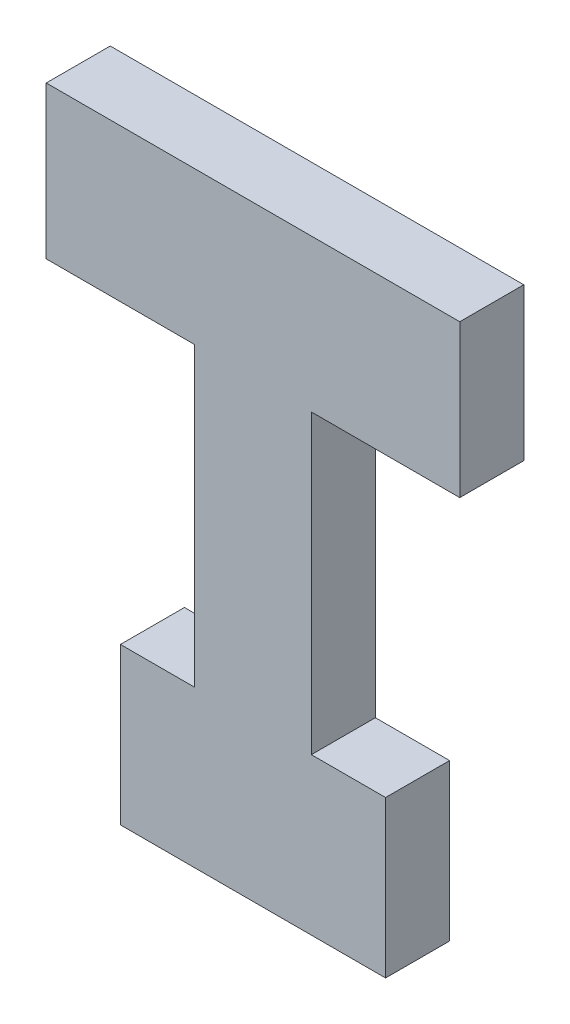
ISO-10303-21;
HEADER;
FILE_DESCRIPTION(('STEP AP214'),'2;1');
FILE_NAME('part.step','',(''),(''),'','','');
FILE_SCHEMA(('AUTOMOTIVE_DESIGN { 1 0 10303 214 1 1 1 1 }'));
ENDSEC;
DATA;
#1=APPLICATION_CONTEXT('core data for automotive mechanical design processes');
#2=APPLICATION_PROTOCOL_DEFINITION('international standard','automotive_design',2000,#1);
#3=PRODUCT_CONTEXT('',#1,'mechanical');
#4=PRODUCT('Part','Part','',(#3));
#5=PRODUCT_RELATED_PRODUCT_CATEGORY('part','',(#4));
#6=PRODUCT_DEFINITION_FORMATION('','',#4);
#7=PRODUCT_DEFINITION_CONTEXT('part definition',#1,'design');
#8=PRODUCT_DEFINITION('design','',#6,#7);
#9=PRODUCT_DEFINITION_SHAPE('','',#8);
#10=(LENGTH_UNIT() NAMED_UNIT(*) SI_UNIT(.MILLI.,.METRE.));
#11=(NAMED_UNIT(*) PLANE_ANGLE_UNIT() SI_UNIT($,.RADIAN.));
#12=(NAMED_UNIT(*) SI_UNIT($,.STERADIAN.) SOLID_ANGLE_UNIT());
#13=UNCERTAINTY_MEASURE_WITH_UNIT(LENGTH_MEASURE(1.E-05),#10,'distance_accuracy_value','');
#14=(GEOMETRIC_REPRESENTATION_CONTEXT(3) GLOBAL_UNCERTAINTY_ASSIGNED_CONTEXT((#13)) GLOBAL_UNIT_ASSIGNED_CONTEXT((#10,
#11,#12)) REPRESENTATION_CONTEXT('',''));
#15=CARTESIAN_POINT('',(0.,0.,0.));
#16=DIRECTION('',(0.,0.,1.));
#17=DIRECTION('',(1.,0.,0.));
#18=AXIS2_PLACEMENT_3D('',#15,#16,#17);
#19=CARTESIAN_POINT('',(32.3020072085508,41.1116455381556,10.));
#20=DIRECTION('',(-1.,0.,0.));
#21=DIRECTION('',(0.,0.,1.));
#22=AXIS2_PLACEMENT_3D('',#19,#20,#21);
#23=PLANE('',#22);
#24=DIRECTION('',(0.,1.,0.));
#25=VECTOR('',#24,1.);
#26=CARTESIAN_POINT('',(32.3020072085508,41.1116455381556,0.));
#27=LINE('',#26,#25);
#28=CARTESIAN_POINT('',(32.3020072085508,17.3101665423813,0.));
#29=VERTEX_POINT('',#28);
#30=CARTESIAN_POINT('',(32.3020072085508,41.1116455381556,0.));
#31=VERTEX_POINT('',#30);
#32=EDGE_CURVE('E159',#29,#31,#27,.T.);
#33=ORIENTED_EDGE('',*,*,#32,.T.);
#34=DIRECTION('',(0.,0.,-1.));
#35=VECTOR('',#34,1.);
#36=CARTESIAN_POINT('',(32.3020072085508,41.1116455381556,10.));
#37=LINE('',#36,#35);
#38=CARTESIAN_POINT('',(32.3020072085508,41.1116455381556,10.));
#39=VERTEX_POINT('',#38);
#40=EDGE_CURVE('E11',#39,#31,#37,.T.);
#41=ORIENTED_EDGE('',*,*,#40,.F.);
#42=DIRECTION('',(0.,1.,0.));
#43=VECTOR('',#42,1.);
#44=CARTESIAN_POINT('',(32.3020072085508,41.1116455381556,10.));
#45=LINE('',#44,#43);
#46=CARTESIAN_POINT('',(32.3020072085508,17.3101665423813,10.));
#47=VERTEX_POINT('',#46);
#48=EDGE_CURVE('E181',#47,#39,#45,.T.);
#49=ORIENTED_EDGE('',*,*,#48,.F.);
#50=DIRECTION('',(0.,0.,-1.));
#51=VECTOR('',#50,1.);
#52=CARTESIAN_POINT('',(32.3020072085508,17.3101665423813,10.));
#53=LINE('',#52,#51);
#54=EDGE_CURVE('E155',#47,#29,#53,.T.);
#55=ORIENTED_EDGE('',*,*,#54,.T.);
#56=EDGE_LOOP('',(#33,#41,#49,#55));
#57=FACE_BOUND('',#56,.T.);
#58=ADVANCED_FACE('F39',(#57),#23,.F.);
#59=CARTESIAN_POINT('',(32.3020072085508,41.1116455381556,10.));
#60=DIRECTION('',(0.,-1.,0.));
#61=DIRECTION('',(0.,0.,-1.));
#62=AXIS2_PLACEMENT_3D('',#59,#60,#61);
#63=PLANE('',#62);
#64=DIRECTION('',(-1.,0.,0.));
#65=VECTOR('',#64,1.);
#66=CARTESIAN_POINT('',(32.3020072085508,41.1116455381556,0.));
#67=LINE('',#66,#65);
#68=CARTESIAN_POINT('',(-32.3020072085508,41.1116455381556,0.));
#69=VERTEX_POINT('',#68);
#70=EDGE_CURVE('E162',#31,#69,#67,.T.);
#71=ORIENTED_EDGE('',*,*,#70,.T.);
#72=DIRECTION('',(0.,0.,-1.));
#73=VECTOR('',#72,1.);
#74=CARTESIAN_POINT('',(-32.3020072085508,41.1116455381556,10.));
#75=LINE('',#74,#73);
#76=CARTESIAN_POINT('',(-32.3020072085508,41.1116455381556,10.));
#77=VERTEX_POINT('',#76);
#78=EDGE_CURVE('E47',#77,#69,#75,.T.);
#79=ORIENTED_EDGE('',*,*,#78,.F.);
#80=DIRECTION('',(-1.,0.,0.));
#81=VECTOR('',#80,1.);
#82=CARTESIAN_POINT('',(32.3020072085508,41.1116455381556,10.));
#83=LINE('',#82,#81);
#84=EDGE_CURVE('E110',#39,#77,#83,.T.);
#85=ORIENTED_EDGE('',*,*,#84,.F.);
#86=ORIENTED_EDGE('',*,*,#40,.T.);
#87=EDGE_LOOP('',(#71,#79,#85,#86));
#88=FACE_BOUND('',#87,.T.);
#89=ADVANCED_FACE('F259',(#88),#63,.F.);
#90=CARTESIAN_POINT('',(-32.3020072085508,41.1116455381556,10.));
#91=DIRECTION('',(1.,0.,0.));
#92=DIRECTION('',(0.,0.,-1.));
#93=AXIS2_PLACEMENT_3D('',#90,#91,#92);
#94=PLANE('',#93);
#95=DIRECTION('',(0.,-1.,0.));
#96=VECTOR('',#95,1.);
#97=CARTESIAN_POINT('',(-32.3020072085508,41.1116455381556,0.));
#98=LINE('',#97,#96);
#99=CARTESIAN_POINT('',(-32.3020072085508,17.3101665423813,0.));
#100=VERTEX_POINT('',#99);
#101=EDGE_CURVE('E164',#69,#100,#98,.T.);
#102=ORIENTED_EDGE('',*,*,#101,.T.);
#103=DIRECTION('',(0.,0.,-1.));
#104=VECTOR('',#103,1.);
#105=CARTESIAN_POINT('',(-32.3020072085508,17.3101665423813,10.));
#106=LINE('',#105,#104);
#107=CARTESIAN_POINT('',(-32.3020072085508,17.3101665423813,10.));
#108=VERTEX_POINT('',#107);
#109=EDGE_CURVE('E200',#108,#100,#106,.T.);
#110=ORIENTED_EDGE('',*,*,#109,.F.);
#111=DIRECTION('',(0.,-1.,0.));
#112=VECTOR('',#111,1.);
#113=CARTESIAN_POINT('',(-32.3020072085508,41.1116455381556,10.));
#114=LINE('',#113,#112);
#115=EDGE_CURVE('E208',#77,#108,#114,.T.);
#116=ORIENTED_EDGE('',*,*,#115,.F.);
#117=ORIENTED_EDGE('',*,*,#78,.T.);
#118=EDGE_LOOP('',(#102,#110,#116,#117));
#119=FACE_BOUND('',#118,.T.);
#120=ADVANCED_FACE('F206',(#119),#94,.F.);
#121=CARTESIAN_POINT('',(-32.3020072085508,17.3101665423813,10.));
#122=DIRECTION('',(0.,1.,0.));
#123=DIRECTION('',(0.,0.,1.));
#124=AXIS2_PLACEMENT_3D('',#121,#122,#123);
#125=PLANE('',#124);
#126=DIRECTION('',(1.,0.,0.));
#127=VECTOR('',#126,1.);
#128=CARTESIAN_POINT('',(-32.3020072085508,17.3101665423813,0.));
#129=LINE('',#128,#127);
#130=CARTESIAN_POINT('',(-9.11874844643301,17.3101665423813,0.));
#131=VERTEX_POINT('',#130);
#132=EDGE_CURVE('E166',#100,#131,#129,.T.);
#133=ORIENTED_EDGE('',*,*,#132,.T.);
#134=DIRECTION('',(0.,0.,-1.));
#135=VECTOR('',#134,1.);
#136=CARTESIAN_POINT('',(-9.11874844643301,17.3101665423813,10.));
#137=LINE('',#136,#135);
#138=CARTESIAN_POINT('',(-9.11874844643301,17.3101665423813,10.));
#139=VERTEX_POINT('',#138);
#140=EDGE_CURVE('E197',#139,#131,#137,.T.);
#141=ORIENTED_EDGE('',*,*,#140,.F.);
#142=DIRECTION('',(1.,0.,0.));
#143=VECTOR('',#142,1.);
#144=CARTESIAN_POINT('',(-32.3020072085508,17.3101665423813,10.));
#145=LINE('',#144,#143);
#146=EDGE_CURVE('E226',#108,#139,#145,.T.);
#147=ORIENTED_EDGE('',*,*,#146,.F.);
#148=ORIENTED_EDGE('',*,*,#109,.T.);
#149=EDGE_LOOP('',(#133,#141,#147,#148));
#150=FACE_BOUND('',#149,.T.);
#151=ADVANCED_FACE('F217',(#150),#125,.F.);
#152=CARTESIAN_POINT('',(-9.11874844643301,17.3101665423813,10.));
#153=DIRECTION('',(1.,0.,0.));
#154=DIRECTION('',(0.,0.,-1.));
#155=AXIS2_PLACEMENT_3D('',#152,#153,#154);
#156=PLANE('',#155);
#157=DIRECTION('',(0.,-1.,0.));
#158=VECTOR('',#157,1.);
#159=CARTESIAN_POINT('',(-9.11874844643301,17.3101665423813,0.));
#160=LINE('',#159,#158);
#161=CARTESIAN_POINT('',(-9.11874844643301,-29.0563509818543,0.));
#162=VERTEX_POINT('',#161);
#163=EDGE_CURVE('E168',#131,#162,#160,.T.);
#164=ORIENTED_EDGE('',*,*,#163,.T.);
#165=DIRECTION('',(0.,0.,-1.));
#166=VECTOR('',#165,1.);
#167=CARTESIAN_POINT('',(-9.11874844643301,-29.0563509818543,10.));
#168=LINE('',#167,#166);
#169=CARTESIAN_POINT('',(-9.11874844643301,-29.0563509818543,10.));
#170=VERTEX_POINT('',#169);
#171=EDGE_CURVE('E194',#170,#162,#168,.T.);
#172=ORIENTED_EDGE('',*,*,#171,.F.);
#173=DIRECTION('',(0.,-1.,0.));
#174=VECTOR('',#173,1.);
#175=CARTESIAN_POINT('',(-9.11874844643301,17.3101665423813,10.));
#176=LINE('',#175,#174);
#177=EDGE_CURVE('E223',#139,#170,#176,.T.);
#178=ORIENTED_EDGE('',*,*,#177,.F.);
#179=ORIENTED_EDGE('',*,*,#140,.T.);
#180=EDGE_LOOP('',(#164,#172,#178,#179));
#181=FACE_BOUND('',#180,.T.);
#182=ADVANCED_FACE('F221',(#181),#156,.F.);
#183=CARTESIAN_POINT('',(-9.11874844643301,-29.0563509818543,10.));
#184=DIRECTION('',(0.,-1.,0.));
#185=DIRECTION('',(0.,0.,-1.));
#186=AXIS2_PLACEMENT_3D('',#183,#184,#185);
#187=PLANE('',#186);
#188=DIRECTION('',(-1.,0.,0.));
#189=VECTOR('',#188,1.);
#190=CARTESIAN_POINT('',(-9.11874844643301,-29.0563509818543,0.));
#191=LINE('',#190,#189);
#192=CARTESIAN_POINT('',(-20.7103778274919,-29.0563509818543,0.));
#193=VERTEX_POINT('',#192);
#194=EDGE_CURVE('E170',#162,#193,#191,.T.);
#195=ORIENTED_EDGE('',*,*,#194,.T.);
#196=DIRECTION('',(0.,0.,-1.));
#197=VECTOR('',#196,1.);
#198=CARTESIAN_POINT('',(-20.7103778274919,-29.0563509818543,10.));
#199=LINE('',#198,#197);
#200=CARTESIAN_POINT('',(-20.7103778274919,-29.0563509818543,10.));
#201=VERTEX_POINT('',#200);
#202=EDGE_CURVE('E191',#201,#193,#199,.T.);
#203=ORIENTED_EDGE('',*,*,#202,.F.);
#204=DIRECTION('',(-1.,0.,0.));
#205=VECTOR('',#204,1.);
#206=CARTESIAN_POINT('',(-9.11874844643301,-29.0563509818543,10.));
#207=LINE('',#206,#205);
#208=EDGE_CURVE('E225',#170,#201,#207,.T.);
#209=ORIENTED_EDGE('',*,*,#208,.F.);
#210=ORIENTED_EDGE('',*,*,#171,.T.);
#211=EDGE_LOOP('',(#195,#203,#209,#210));
#212=FACE_BOUND('',#211,.T.);
#213=ADVANCED_FACE('F272',(#212),#187,.F.);
#214=CARTESIAN_POINT('',(-20.7103778274919,-29.0563509818543,10.));
#215=DIRECTION('',(1.,0.,0.));
#216=DIRECTION('',(0.,0.,-1.));
#217=AXIS2_PLACEMENT_3D('',#214,#215,#216);
#218=PLANE('',#217);
#219=DIRECTION('',(0.,-1.,0.));
#220=VECTOR('',#219,1.);
#221=CARTESIAN_POINT('',(-20.7103778274919,-29.0563509818543,0.));
#222=LINE('',#221,#220);
#223=CARTESIAN_POINT('',(-20.7103778274919,-53.4760502112851,0.));
#224=VERTEX_POINT('',#223);
#225=EDGE_CURVE('E172',#193,#224,#222,.T.);
#226=ORIENTED_EDGE('',*,*,#225,.T.);
#227=DIRECTION('',(0.,0.,-1.));
#228=VECTOR('',#227,1.);
#229=CARTESIAN_POINT('',(-20.7103778274919,-53.4760502112851,10.));
#230=LINE('',#229,#228);
#231=CARTESIAN_POINT('',(-20.7103778274919,-53.4760502112851,10.));
#232=VERTEX_POINT('',#231);
#233=EDGE_CURVE('E188',#232,#224,#230,.T.);
#234=ORIENTED_EDGE('',*,*,#233,.F.);
#235=DIRECTION('',(0.,-1.,0.));
#236=VECTOR('',#235,1.);
#237=CARTESIAN_POINT('',(-20.7103778274919,-29.0563509818543,10.));
#238=LINE('',#237,#236);
#239=EDGE_CURVE('E228',#201,#232,#238,.T.);
#240=ORIENTED_EDGE('',*,*,#239,.F.);
#241=ORIENTED_EDGE('',*,*,#202,.T.);
#242=EDGE_LOOP('',(#226,#234,#240,#241));
#243=FACE_BOUND('',#242,.T.);
#244=ADVANCED_FACE('F275',(#243),#218,.F.);
#245=CARTESIAN_POINT('',(-20.7103778274919,-53.4760502112851,10.));
#246=DIRECTION('',(0.,1.,0.));
#247=DIRECTION('',(0.,0.,1.));
#248=AXIS2_PLACEMENT_3D('',#245,#246,#247);
#249=PLANE('',#248);
#250=DIRECTION('',(1.,0.,0.));
#251=VECTOR('',#250,1.);
#252=CARTESIAN_POINT('',(-20.7103778274919,-53.4760502112851,0.));
#253=LINE('',#252,#251);
#254=CARTESIAN_POINT('',(20.7103778274919,-53.4760502112851,0.));
#255=VERTEX_POINT('',#254);
#256=EDGE_CURVE('E174',#224,#255,#253,.T.);
#257=ORIENTED_EDGE('',*,*,#256,.T.);
#258=DIRECTION('',(0.,0.,-1.));
#259=VECTOR('',#258,1.);
#260=CARTESIAN_POINT('',(20.7103778274919,-53.4760502112851,10.));
#261=LINE('',#260,#259);
#262=CARTESIAN_POINT('',(20.7103778274919,-53.4760502112851,10.));
#263=VERTEX_POINT('',#262);
#264=EDGE_CURVE('E185',#263,#255,#261,.T.);
#265=ORIENTED_EDGE('',*,*,#264,.F.);
#266=DIRECTION('',(1.,0.,0.));
#267=VECTOR('',#266,1.);
#268=CARTESIAN_POINT('',(-20.7103778274919,-53.4760502112851,10.));
#269=LINE('',#268,#267);
#270=EDGE_CURVE('E234',#232,#263,#269,.T.);
#271=ORIENTED_EDGE('',*,*,#270,.F.);
#272=ORIENTED_EDGE('',*,*,#233,.T.);
#273=EDGE_LOOP('',(#257,#265,#271,#272));
#274=FACE_BOUND('',#273,.T.);
#275=ADVANCED_FACE('F240',(#274),#249,.F.);
#276=CARTESIAN_POINT('',(20.7103778274919,-29.0563509818543,10.));
#277=DIRECTION('',(-1.,0.,0.));
#278=DIRECTION('',(0.,0.,1.));
#279=AXIS2_PLACEMENT_3D('',#276,#277,#278);
#280=PLANE('',#279);
#281=DIRECTION('',(0.,1.,0.));
#282=VECTOR('',#281,1.);
#283=CARTESIAN_POINT('',(20.7103778274919,-29.0563509818543,0.));
#284=LINE('',#283,#282);
#285=CARTESIAN_POINT('',(20.7103778274919,-29.0563509818543,0.));
#286=VERTEX_POINT('',#285);
#287=EDGE_CURVE('E176',#255,#286,#284,.T.);
#288=ORIENTED_EDGE('',*,*,#287,.T.);
#289=DIRECTION('',(0.,0.,-1.));
#290=VECTOR('',#289,1.);
#291=CARTESIAN_POINT('',(20.7103778274919,-29.0563509818543,10.));
#292=LINE('',#291,#290);
#293=CARTESIAN_POINT('',(20.7103778274919,-29.0563509818543,10.));
#294=VERTEX_POINT('',#293);
#295=EDGE_CURVE('E150',#294,#286,#292,.T.);
#296=ORIENTED_EDGE('',*,*,#295,.F.);
#297=DIRECTION('',(0.,1.,0.));
#298=VECTOR('',#297,1.);
#299=CARTESIAN_POINT('',(20.7103778274919,-29.0563509818543,10.));
#300=LINE('',#299,#298);
#301=EDGE_CURVE('E141',#263,#294,#300,.T.);
#302=ORIENTED_EDGE('',*,*,#301,.F.);
#303=ORIENTED_EDGE('',*,*,#264,.T.);
#304=EDGE_LOOP('',(#288,#296,#302,#303));
#305=FACE_BOUND('',#304,.T.);
#306=ADVANCED_FACE('F244',(#305),#280,.F.);
#307=CARTESIAN_POINT('',(9.11874844643301,-29.0563509818543,10.));
#308=DIRECTION('',(0.,-1.,0.));
#309=DIRECTION('',(0.,0.,-1.));
#310=AXIS2_PLACEMENT_3D('',#307,#308,#309);
#311=PLANE('',#310);
#312=DIRECTION('',(-1.,0.,0.));
#313=VECTOR('',#312,1.);
#314=CARTESIAN_POINT('',(9.11874844643301,-29.0563509818543,0.));
#315=LINE('',#314,#313);
#316=CARTESIAN_POINT('',(9.11874844643301,-29.0563509818543,0.));
#317=VERTEX_POINT('',#316);
#318=EDGE_CURVE('E149',#286,#317,#315,.T.);
#319=ORIENTED_EDGE('',*,*,#318,.T.);
#320=DIRECTION('',(0.,0.,-1.));
#321=VECTOR('',#320,1.);
#322=CARTESIAN_POINT('',(9.11874844643301,-29.0563509818543,10.));
#323=LINE('',#322,#321);
#324=CARTESIAN_POINT('',(9.11874844643301,-29.0563509818543,10.));
#325=VERTEX_POINT('',#324);
#326=EDGE_CURVE('E146',#325,#317,#323,.T.);
#327=ORIENTED_EDGE('',*,*,#326,.F.);
#328=DIRECTION('',(-1.,0.,0.));
#329=VECTOR('',#328,1.);
#330=CARTESIAN_POINT('',(9.11874844643301,-29.0563509818543,10.));
#331=LINE('',#330,#329);
#332=EDGE_CURVE('E135',#294,#325,#331,.T.);
#333=ORIENTED_EDGE('',*,*,#332,.F.);
#334=ORIENTED_EDGE('',*,*,#295,.T.);
#335=EDGE_LOOP('',(#319,#327,#333,#334));
#336=FACE_BOUND('',#335,.T.);
#337=ADVANCED_FACE('F147',(#336),#311,.F.);
#338=CARTESIAN_POINT('',(9.11874844643301,17.3101665423813,10.));
#339=DIRECTION('',(-1.,0.,0.));
#340=DIRECTION('',(0.,0.,1.));
#341=AXIS2_PLACEMENT_3D('',#338,#339,#340);
#342=PLANE('',#341);
#343=DIRECTION('',(0.,1.,0.));
#344=VECTOR('',#343,1.);
#345=CARTESIAN_POINT('',(9.11874844643301,17.3101665423813,0.));
#346=LINE('',#345,#344);
#347=CARTESIAN_POINT('',(9.11874844643301,17.3101665423813,0.));
#348=VERTEX_POINT('',#347);
#349=EDGE_CURVE('E96',#317,#348,#346,.T.);
#350=ORIENTED_EDGE('',*,*,#349,.T.);
#351=DIRECTION('',(0.,0.,-1.));
#352=VECTOR('',#351,1.);
#353=CARTESIAN_POINT('',(9.11874844643301,17.3101665423813,10.));
#354=LINE('',#353,#352);
#355=CARTESIAN_POINT('',(9.11874844643301,17.3101665423813,10.));
#356=VERTEX_POINT('',#355);
#357=EDGE_CURVE('E151',#356,#348,#354,.T.);
#358=ORIENTED_EDGE('',*,*,#357,.F.);
#359=DIRECTION('',(0.,1.,0.));
#360=VECTOR('',#359,1.);
#361=CARTESIAN_POINT('',(9.11874844643301,17.3101665423813,10.));
#362=LINE('',#361,#360);
#363=EDGE_CURVE('E139',#325,#356,#362,.T.);
#364=ORIENTED_EDGE('',*,*,#363,.F.);
#365=ORIENTED_EDGE('',*,*,#326,.T.);
#366=EDGE_LOOP('',(#350,#358,#364,#365));
#367=FACE_BOUND('',#366,.T.);
#368=ADVANCED_FACE('F153',(#367),#342,.F.);
#369=CARTESIAN_POINT('',(32.3020072085508,17.3101665423813,10.));
#370=DIRECTION('',(0.,1.,0.));
#371=DIRECTION('',(0.,0.,1.));
#372=AXIS2_PLACEMENT_3D('',#369,#370,#371);
#373=PLANE('',#372);
#374=DIRECTION('',(1.,0.,0.));
#375=VECTOR('',#374,1.);
#376=CARTESIAN_POINT('',(32.3020072085508,17.3101665423813,0.));
#377=LINE('',#376,#375);
#378=EDGE_CURVE('E102',#348,#29,#377,.T.);
#379=ORIENTED_EDGE('',*,*,#378,.T.);
#380=ORIENTED_EDGE('',*,*,#54,.F.);
#381=DIRECTION('',(1.,0.,0.));
#382=VECTOR('',#381,1.);
#383=CARTESIAN_POINT('',(32.3020072085508,17.3101665423813,10.));
#384=LINE('',#383,#382);
#385=EDGE_CURVE('E55',#356,#47,#384,.T.);
#386=ORIENTED_EDGE('',*,*,#385,.F.);
#387=ORIENTED_EDGE('',*,*,#357,.T.);
#388=EDGE_LOOP('',(#379,#380,#386,#387));
#389=FACE_BOUND('',#388,.T.);
#390=ADVANCED_FACE('F248',(#389),#373,.F.);
#391=CARTESIAN_POINT('',(0.,0.,10.));
#392=DIRECTION('',(0.,0.,-1.));
#393=DIRECTION('',(-1.,0.,0.));
#394=AXIS2_PLACEMENT_3D('',#391,#392,#393);
#395=PLANE('',#394);
#396=ORIENTED_EDGE('',*,*,#48,.T.);
#397=ORIENTED_EDGE('',*,*,#84,.T.);
#398=ORIENTED_EDGE('',*,*,#115,.T.);
#399=ORIENTED_EDGE('',*,*,#146,.T.);
#400=ORIENTED_EDGE('',*,*,#177,.T.);
#401=ORIENTED_EDGE('',*,*,#208,.T.);
#402=ORIENTED_EDGE('',*,*,#239,.T.);
#403=ORIENTED_EDGE('',*,*,#270,.T.);
#404=ORIENTED_EDGE('',*,*,#301,.T.);
#405=ORIENTED_EDGE('',*,*,#332,.T.);
#406=ORIENTED_EDGE('',*,*,#363,.T.);
#407=ORIENTED_EDGE('',*,*,#385,.T.);
#408=EDGE_LOOP('',(#396,#397,#398,#399,#400,#401,#402,#403,#404,#405,#406,#407));
#409=FACE_BOUND('',#408,.T.);
#410=ADVANCED_FACE('F137',(#409),#395,.F.);
#411=CARTESIAN_POINT('',(0.,0.,0.));
#412=DIRECTION('',(0.,0.,-1.));
#413=DIRECTION('',(-1.,0.,0.));
#414=AXIS2_PLACEMENT_3D('',#411,#412,#413);
#415=PLANE('',#414);
#416=ORIENTED_EDGE('',*,*,#32,.F.);
#417=ORIENTED_EDGE('',*,*,#378,.F.);
#418=ORIENTED_EDGE('',*,*,#349,.F.);
#419=ORIENTED_EDGE('',*,*,#318,.F.);
#420=ORIENTED_EDGE('',*,*,#287,.F.);
#421=ORIENTED_EDGE('',*,*,#256,.F.);
#422=ORIENTED_EDGE('',*,*,#225,.F.);
#423=ORIENTED_EDGE('',*,*,#194,.F.);
#424=ORIENTED_EDGE('',*,*,#163,.F.);
#425=ORIENTED_EDGE('',*,*,#132,.F.);
#426=ORIENTED_EDGE('',*,*,#101,.F.);
#427=ORIENTED_EDGE('',*,*,#70,.F.);
#428=EDGE_LOOP('',(#416,#417,#418,#419,#420,#421,#422,#423,#424,#425,#426,#427));
#429=FACE_BOUND('',#428,.T.);
#430=ADVANCED_FACE('F212',(#429),#415,.T.);
#431=CLOSED_SHELL('',(#58,#89,#120,#151,#182,#213,#244,#275,#306,#337,#368,#390,#410,#430));
#432=MANIFOLD_SOLID_BREP('B2',#431);
#433=ADVANCED_BREP_SHAPE_REPRESENTATION('',(#18,#432),#14);
#434=SHAPE_DEFINITION_REPRESENTATION(#9,#433);
ENDSEC;
END-ISO-10303-21;
